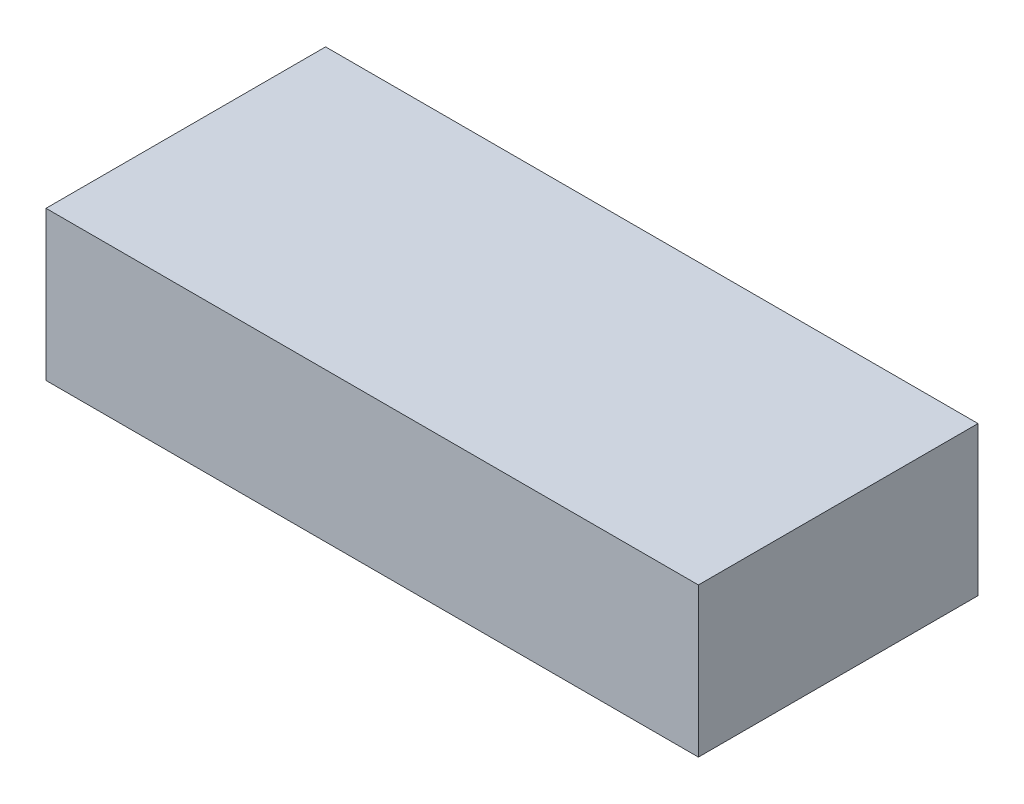
ISO-10303-21;
HEADER;
FILE_DESCRIPTION(('STEP AP214'),'2;1');
FILE_NAME('part.step','',(''),(''),'','','');
FILE_SCHEMA(('AUTOMOTIVE_DESIGN { 1 0 10303 214 1 1 1 1 }'));
ENDSEC;
DATA;
#1=APPLICATION_CONTEXT('core data for automotive mechanical design processes');
#2=APPLICATION_PROTOCOL_DEFINITION('international standard','automotive_design',2000,#1);
#3=PRODUCT_CONTEXT('',#1,'mechanical');
#4=PRODUCT('Part','Part','',(#3));
#5=PRODUCT_RELATED_PRODUCT_CATEGORY('part','',(#4));
#6=PRODUCT_DEFINITION_FORMATION('','',#4);
#7=PRODUCT_DEFINITION_CONTEXT('part definition',#1,'design');
#8=PRODUCT_DEFINITION('design','',#6,#7);
#9=PRODUCT_DEFINITION_SHAPE('','',#8);
#10=(LENGTH_UNIT() NAMED_UNIT(*) SI_UNIT(.MILLI.,.METRE.));
#11=(NAMED_UNIT(*) PLANE_ANGLE_UNIT() SI_UNIT($,.RADIAN.));
#12=(NAMED_UNIT(*) SI_UNIT($,.STERADIAN.) SOLID_ANGLE_UNIT());
#13=UNCERTAINTY_MEASURE_WITH_UNIT(LENGTH_MEASURE(1.E-05),#10,'distance_accuracy_value','');
#14=(GEOMETRIC_REPRESENTATION_CONTEXT(3) GLOBAL_UNCERTAINTY_ASSIGNED_CONTEXT((#13)) GLOBAL_UNIT_ASSIGNED_CONTEXT((#10,
#11,#12)) REPRESENTATION_CONTEXT('',''));
#15=CARTESIAN_POINT('',(0.,0.,0.));
#16=DIRECTION('',(0.,0.,1.));
#17=DIRECTION('',(1.,0.,0.));
#18=AXIS2_PLACEMENT_3D('',#15,#16,#17);
#19=CARTESIAN_POINT('',(0.,1.6,0.));
#20=DIRECTION('',(1.,0.,0.));
#21=DIRECTION('',(0.,0.,-1.));
#22=AXIS2_PLACEMENT_3D('',#19,#20,#21);
#23=PLANE('',#22);
#24=DIRECTION('',(0.,0.,1.));
#25=VECTOR('',#24,1.);
#26=CARTESIAN_POINT('',(0.,0.,0.));
#27=LINE('',#26,#25);
#28=CARTESIAN_POINT('',(0.,0.,-3.));
#29=VERTEX_POINT('',#28);
#30=CARTESIAN_POINT('',(0.,0.,0.));
#31=VERTEX_POINT('',#30);
#32=EDGE_CURVE('E107',#29,#31,#27,.T.);
#33=ORIENTED_EDGE('',*,*,#32,.T.);
#34=DIRECTION('',(0.,-1.,0.));
#35=VECTOR('',#34,1.);
#36=CARTESIAN_POINT('',(0.,1.6,0.));
#37=LINE('',#36,#35);
#38=CARTESIAN_POINT('',(0.,1.6,0.));
#39=VERTEX_POINT('',#38);
#40=EDGE_CURVE('E11',#39,#31,#37,.T.);
#41=ORIENTED_EDGE('',*,*,#40,.F.);
#42=DIRECTION('',(0.,0.,1.));
#43=VECTOR('',#42,1.);
#44=CARTESIAN_POINT('',(0.,1.6,0.));
#45=LINE('',#44,#43);
#46=CARTESIAN_POINT('',(0.,1.6,-3.));
#47=VERTEX_POINT('',#46);
#48=EDGE_CURVE('E91',#47,#39,#45,.T.);
#49=ORIENTED_EDGE('',*,*,#48,.F.);
#50=DIRECTION('',(0.,-1.,0.));
#51=VECTOR('',#50,1.);
#52=CARTESIAN_POINT('',(0.,1.6,-3.));
#53=LINE('',#52,#51);
#54=EDGE_CURVE('E103',#47,#29,#53,.T.);
#55=ORIENTED_EDGE('',*,*,#54,.T.);
#56=EDGE_LOOP('',(#33,#41,#49,#55));
#57=FACE_BOUND('',#56,.T.);
#58=ADVANCED_FACE('F39',(#57),#23,.F.);
#59=CARTESIAN_POINT('',(0.,1.6,0.));
#60=DIRECTION('',(0.,0.,-1.));
#61=DIRECTION('',(-1.,0.,0.));
#62=AXIS2_PLACEMENT_3D('',#59,#60,#61);
#63=PLANE('',#62);
#64=DIRECTION('',(1.,0.,0.));
#65=VECTOR('',#64,1.);
#66=CARTESIAN_POINT('',(0.,0.,0.));
#67=LINE('',#66,#65);
#68=CARTESIAN_POINT('',(7.,0.,0.));
#69=VERTEX_POINT('',#68);
#70=EDGE_CURVE('E96',#31,#69,#67,.T.);
#71=ORIENTED_EDGE('',*,*,#70,.T.);
#72=DIRECTION('',(0.,-1.,0.));
#73=VECTOR('',#72,1.);
#74=CARTESIAN_POINT('',(7.,1.6,0.));
#75=LINE('',#74,#73);
#76=CARTESIAN_POINT('',(7.,1.6,0.));
#77=VERTEX_POINT('',#76);
#78=EDGE_CURVE('E48',#77,#69,#75,.T.);
#79=ORIENTED_EDGE('',*,*,#78,.F.);
#80=DIRECTION('',(1.,0.,0.));
#81=VECTOR('',#80,1.);
#82=CARTESIAN_POINT('',(0.,1.6,0.));
#83=LINE('',#82,#81);
#84=EDGE_CURVE('E86',#39,#77,#83,.T.);
#85=ORIENTED_EDGE('',*,*,#84,.F.);
#86=ORIENTED_EDGE('',*,*,#40,.T.);
#87=EDGE_LOOP('',(#71,#79,#85,#86));
#88=FACE_BOUND('',#87,.T.);
#89=ADVANCED_FACE('F95',(#88),#63,.F.);
#90=CARTESIAN_POINT('',(7.,1.6,0.));
#91=DIRECTION('',(-1.,0.,0.));
#92=DIRECTION('',(0.,0.,1.));
#93=AXIS2_PLACEMENT_3D('',#90,#91,#92);
#94=PLANE('',#93);
#95=DIRECTION('',(0.,0.,-1.));
#96=VECTOR('',#95,1.);
#97=CARTESIAN_POINT('',(7.,0.,0.));
#98=LINE('',#97,#96);
#99=CARTESIAN_POINT('',(7.,0.,-3.));
#100=VERTEX_POINT('',#99);
#101=EDGE_CURVE('E73',#69,#100,#98,.T.);
#102=ORIENTED_EDGE('',*,*,#101,.T.);
#103=DIRECTION('',(0.,-1.,0.));
#104=VECTOR('',#103,1.);
#105=CARTESIAN_POINT('',(7.,1.6,-3.));
#106=LINE('',#105,#104);
#107=CARTESIAN_POINT('',(7.,1.6,-3.));
#108=VERTEX_POINT('',#107);
#109=EDGE_CURVE('E98',#108,#100,#106,.T.);
#110=ORIENTED_EDGE('',*,*,#109,.F.);
#111=DIRECTION('',(0.,0.,-1.));
#112=VECTOR('',#111,1.);
#113=CARTESIAN_POINT('',(7.,1.6,0.));
#114=LINE('',#113,#112);
#115=EDGE_CURVE('E89',#77,#108,#114,.T.);
#116=ORIENTED_EDGE('',*,*,#115,.F.);
#117=ORIENTED_EDGE('',*,*,#78,.T.);
#118=EDGE_LOOP('',(#102,#110,#116,#117));
#119=FACE_BOUND('',#118,.T.);
#120=ADVANCED_FACE('F99',(#119),#94,.F.);
#121=CARTESIAN_POINT('',(0.,1.6,-3.));
#122=DIRECTION('',(0.,0.,1.));
#123=DIRECTION('',(1.,0.,0.));
#124=AXIS2_PLACEMENT_3D('',#121,#122,#123);
#125=PLANE('',#124);
#126=DIRECTION('',(-1.,0.,0.));
#127=VECTOR('',#126,1.);
#128=CARTESIAN_POINT('',(0.,0.,-3.));
#129=LINE('',#128,#127);
#130=EDGE_CURVE('E79',#100,#29,#129,.T.);
#131=ORIENTED_EDGE('',*,*,#130,.T.);
#132=ORIENTED_EDGE('',*,*,#54,.F.);
#133=DIRECTION('',(-1.,0.,0.));
#134=VECTOR('',#133,1.);
#135=CARTESIAN_POINT('',(0.,1.6,-3.));
#136=LINE('',#135,#134);
#137=EDGE_CURVE('E56',#108,#47,#136,.T.);
#138=ORIENTED_EDGE('',*,*,#137,.F.);
#139=ORIENTED_EDGE('',*,*,#109,.T.);
#140=EDGE_LOOP('',(#131,#132,#138,#139));
#141=FACE_BOUND('',#140,.T.);
#142=ADVANCED_FACE('F120',(#141),#125,.F.);
#143=CARTESIAN_POINT('',(0.,1.6,0.));
#144=DIRECTION('',(0.,-1.,0.));
#145=DIRECTION('',(0.,0.,-1.));
#146=AXIS2_PLACEMENT_3D('',#143,#144,#145);
#147=PLANE('',#146);
#148=ORIENTED_EDGE('',*,*,#48,.T.);
#149=ORIENTED_EDGE('',*,*,#84,.T.);
#150=ORIENTED_EDGE('',*,*,#115,.T.);
#151=ORIENTED_EDGE('',*,*,#137,.T.);
#152=EDGE_LOOP('',(#148,#149,#150,#151));
#153=FACE_BOUND('',#152,.T.);
#154=ADVANCED_FACE('F87',(#153),#147,.F.);
#155=CARTESIAN_POINT('',(0.,0.,0.));
#156=DIRECTION('',(0.,-1.,0.));
#157=DIRECTION('',(0.,0.,-1.));
#158=AXIS2_PLACEMENT_3D('',#155,#156,#157);
#159=PLANE('',#158);
#160=ORIENTED_EDGE('',*,*,#32,.F.);
#161=ORIENTED_EDGE('',*,*,#130,.F.);
#162=ORIENTED_EDGE('',*,*,#101,.F.);
#163=ORIENTED_EDGE('',*,*,#70,.F.);
#164=EDGE_LOOP('',(#160,#161,#162,#163));
#165=FACE_BOUND('',#164,.T.);
#166=ADVANCED_FACE('F123',(#165),#159,.T.);
#167=CLOSED_SHELL('',(#58,#89,#120,#142,#154,#166));
#168=MANIFOLD_SOLID_BREP('B2',#167);
#169=ADVANCED_BREP_SHAPE_REPRESENTATION('',(#18,#168),#14);
#170=SHAPE_DEFINITION_REPRESENTATION(#9,#169);
ENDSEC;
END-ISO-10303-21;
